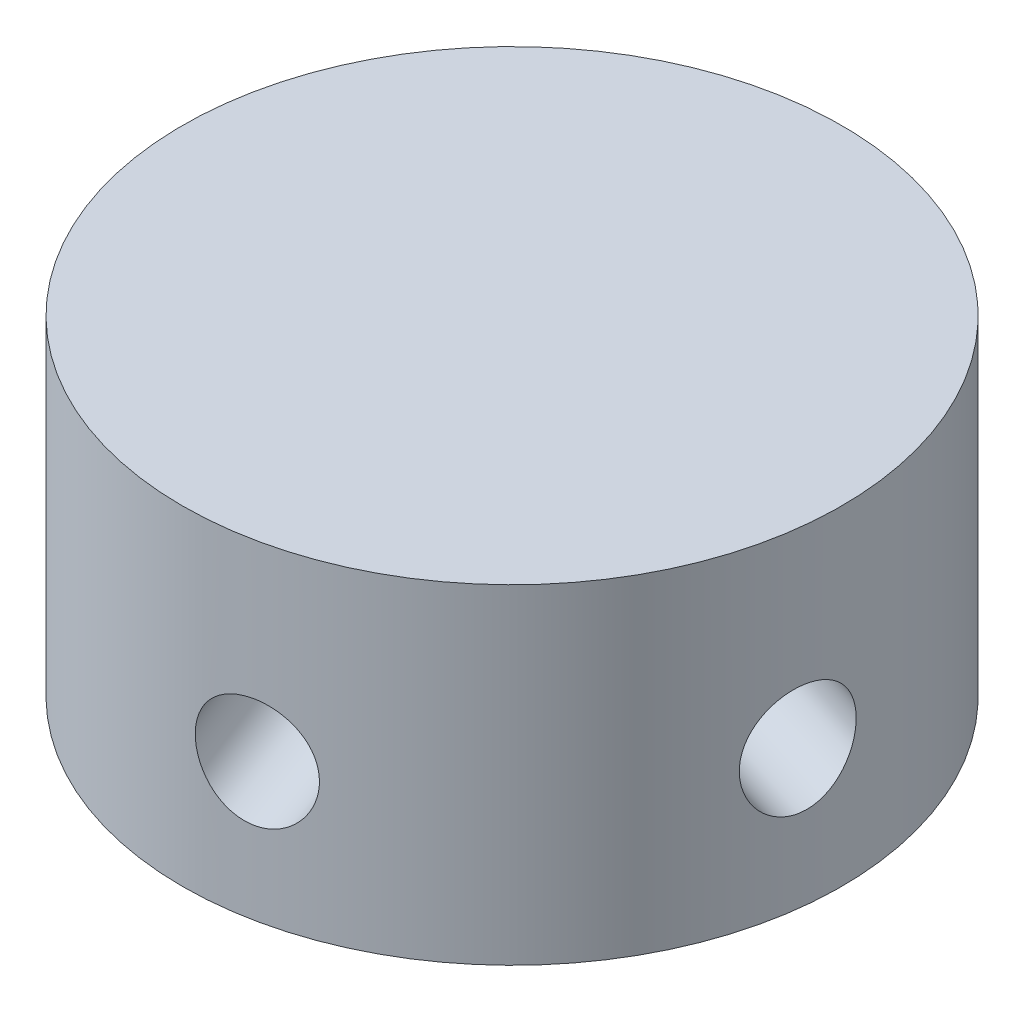
ISO-10303-21;
HEADER;
FILE_DESCRIPTION(('STEP AP214'),'2;1');
FILE_NAME('part.step','',(''),(''),'','','');
FILE_SCHEMA(('AUTOMOTIVE_DESIGN { 1 0 10303 214 1 1 1 1 }'));
ENDSEC;
DATA;
#1=APPLICATION_CONTEXT('core data for automotive mechanical design processes');
#2=APPLICATION_PROTOCOL_DEFINITION('international standard','automotive_design',2000,#1);
#3=PRODUCT_CONTEXT('',#1,'mechanical');
#4=PRODUCT('Part','Part','',(#3));
#5=PRODUCT_RELATED_PRODUCT_CATEGORY('part','',(#4));
#6=PRODUCT_DEFINITION_FORMATION('','',#4);
#7=PRODUCT_DEFINITION_CONTEXT('part definition',#1,'design');
#8=PRODUCT_DEFINITION('design','',#6,#7);
#9=PRODUCT_DEFINITION_SHAPE('','',#8);
#10=(LENGTH_UNIT() NAMED_UNIT(*) SI_UNIT(.MILLI.,.METRE.));
#11=(NAMED_UNIT(*) PLANE_ANGLE_UNIT() SI_UNIT($,.RADIAN.));
#12=(NAMED_UNIT(*) SI_UNIT($,.STERADIAN.) SOLID_ANGLE_UNIT());
#13=UNCERTAINTY_MEASURE_WITH_UNIT(LENGTH_MEASURE(1.E-05),#10,'distance_accuracy_value','');
#14=(GEOMETRIC_REPRESENTATION_CONTEXT(3) GLOBAL_UNCERTAINTY_ASSIGNED_CONTEXT((#13)) GLOBAL_UNIT_ASSIGNED_CONTEXT((#10,
#11,#12)) REPRESENTATION_CONTEXT('',''));
#15=CARTESIAN_POINT('',(0.,0.,0.));
#16=DIRECTION('',(0.,0.,1.));
#17=DIRECTION('',(1.,0.,0.));
#18=AXIS2_PLACEMENT_3D('',#15,#16,#17);
#19=CARTESIAN_POINT('',(0.,-7.,0.));
#20=DIRECTION('',(0.,1.,0.));
#21=DIRECTION('',(0.,0.,1.));
#22=AXIS2_PLACEMENT_3D('',#19,#20,#21);
#23=CYLINDRICAL_SURFACE('',#22,10.);
#24=CARTESIAN_POINT('',(-6.18040658631982,-2.80419257592395,-7.8614613417465));
#25=CARTESIAN_POINT('',(-6.18041069378116,-2.90234784309518,-7.86145985033207));
#26=CARTESIAN_POINT('',(-6.18709037837394,-3.00057569421897,-7.85622071906424));
#27=CARTESIAN_POINT('',(-6.21328313433534,-3.19429375623175,-7.83552031582612));
#28=CARTESIAN_POINT('',(-6.23281569685475,-3.28977957900091,-7.82004351843738));
#29=CARTESIAN_POINT('',(-6.28376502842835,-3.47517276967888,-7.77916181257504));
#30=CARTESIAN_POINT('',(-6.31516706385408,-3.56508689335964,-7.75376921134334));
#31=CARTESIAN_POINT('',(-6.38865971296323,-3.73693258914234,-7.69332712533847));
#32=CARTESIAN_POINT('',(-6.4307480948599,-3.81886582307326,-7.65827965680337));
#33=CARTESIAN_POINT('',(-6.5244898689366,-3.97278415857681,-7.5785772815116));
#34=CARTESIAN_POINT('',(-6.57620342226979,-4.04470142029659,-7.53386164380033));
#35=CARTESIAN_POINT('',(-6.68725447470501,-4.17534392326118,-7.43546314485651));
#36=CARTESIAN_POINT('',(-6.74659001159406,-4.23407254914793,-7.38178259049963));
#37=CARTESIAN_POINT('',(-6.86747316238743,-4.33309816932697,-7.26940523116863));
#38=CARTESIAN_POINT('',(-6.92874101682425,-4.37420107240322,-7.21111983965897));
#39=CARTESIAN_POINT('',(-7.05399457373656,-4.44028699170343,-7.08863909005609));
#40=CARTESIAN_POINT('',(-7.1179783887015,-4.46528101377072,-7.02444780130276));
#41=CARTESIAN_POINT('',(-7.2408979989159,-4.4964619358335,-6.8975752553002));
#42=CARTESIAN_POINT('',(-7.2998114016746,-4.50403920222909,-6.83521185289701));
#43=CARTESIAN_POINT('',(-7.41599656463583,-4.50415740699111,-6.70897494081218));
#44=CARTESIAN_POINT('',(-7.47326875792584,-4.49670234989006,-6.64510183778663));
#45=CARTESIAN_POINT('',(-7.58217917913624,-4.46774917979113,-6.52051620708892));
#46=CARTESIAN_POINT('',(-7.63395240425703,-4.44684381033082,-6.45978210248453));
#47=CARTESIAN_POINT('',(-7.73327325732892,-4.39246364343792,-6.34054506008151));
#48=CARTESIAN_POINT('',(-7.78082040703957,-4.35898742566933,-6.28204237522627));
#49=CARTESIAN_POINT('',(-7.87234067780815,-4.27943950635112,-6.16699590740821));
#50=CARTESIAN_POINT('',(-7.91614456968675,-4.23298937226029,-6.11058005058202));
#51=CARTESIAN_POINT('',(-7.99779809730484,-4.12962391405995,-6.00331398885442));
#52=CARTESIAN_POINT('',(-8.03564580230697,-4.0727052094075,-5.95246559029986));
#53=CARTESIAN_POINT('',(-8.10775604691805,-3.94529584290214,-5.85391396776607));
#54=CARTESIAN_POINT('',(-8.14151429694982,-3.87409566698231,-5.80675887231004));
#55=CARTESIAN_POINT('',(-8.20153607142322,-3.7234916320388,-5.72167140512811));
#56=CARTESIAN_POINT('',(-8.22779684344153,-3.64408477476704,-5.68374242118406));
#57=CARTESIAN_POINT('',(-8.27416487683236,-3.47360706993731,-5.61604816884507));
#58=CARTESIAN_POINT('',(-8.29374975039458,-3.38211206928312,-5.58698947660018));
#59=CARTESIAN_POINT('',(-8.32405447795391,-3.19457090082377,-5.54173833167563));
#60=CARTESIAN_POINT('',(-8.33477322064973,-3.09852416408824,-5.52554749189225));
#61=CARTESIAN_POINT('',(-8.34721005269621,-2.9032972349777,-5.50674303326532));
#62=CARTESIAN_POINT('',(-8.3488141503021,-2.80409289685925,-5.50430137103277));
#63=CARTESIAN_POINT('',(-8.34248086251898,-2.60668729118918,-5.51389588691072));
#64=CARTESIAN_POINT('',(-8.33454554272457,-2.50848581112889,-5.52592893077623));
#65=CARTESIAN_POINT('',(-8.30942286587974,-2.31961542955216,-5.56362998091201));
#66=CARTESIAN_POINT('',(-8.29257179549985,-2.22880300805648,-5.58880197157573));
#67=CARTESIAN_POINT('',(-8.24983112683427,-2.05390062311326,-5.65170093491985));
#68=CARTESIAN_POINT('',(-8.2239437144287,-1.96980903994349,-5.68942487119679));
#69=CARTESIAN_POINT('',(-8.16459239437144,-1.81433058777238,-5.77425211059514));
#70=CARTESIAN_POINT('',(-8.13148151790137,-1.74256485669541,-5.82090888833601));
#71=CARTESIAN_POINT('',(-8.05758249695944,-1.60987893076595,-5.92277904761302));
#72=CARTESIAN_POINT('',(-8.01679522194458,-1.54895750916636,-5.97799145998169));
#73=CARTESIAN_POINT('',(-7.9291356931972,-1.44084866104323,-6.09376440834492));
#74=CARTESIAN_POINT('',(-7.88240129647873,-1.39341115377824,-6.15419605110393));
#75=CARTESIAN_POINT('',(-7.78316118923601,-1.31197818446462,-6.27923276033471));
#76=CARTESIAN_POINT('',(-7.73065563818385,-1.27798235110665,-6.34383771146674));
#77=CARTESIAN_POINT('',(-7.62126393920933,-1.22444215000392,-6.47484261923763));
#78=CARTESIAN_POINT('',(-7.56439461267379,-1.20484509181928,-6.54123510023709));
#79=CARTESIAN_POINT('',(-7.44753128648001,-1.18040665367519,-6.67398645668238));
#80=CARTESIAN_POINT('',(-7.38753727259583,-1.17556534090098,-6.74034533197383));
#81=CARTESIAN_POINT('',(-7.26603697545491,-1.18076540289665,-6.87114840534427));
#82=CARTESIAN_POINT('',(-7.20452970867928,-1.1908167224365,-6.93559129467686));
#83=CARTESIAN_POINT('',(-7.08188582181877,-1.22556046932424,-7.06077720898353));
#84=CARTESIAN_POINT('',(-7.02074920150364,-1.25025288757539,-7.12152023625636));
#85=CARTESIAN_POINT('',(-6.90082161745449,-1.31362986693059,-7.23779262794899));
#86=CARTESIAN_POINT('',(-6.84203053304105,-1.3523137071329,-7.29332226080096));
#87=CARTESIAN_POINT('',(-6.72880950003165,-1.4426321301286,-7.39790984547475));
#88=CARTESIAN_POINT('',(-6.67437928718442,-1.49426592742231,-7.44696818954728));
#89=CARTESIAN_POINT('',(-6.57186287088399,-1.60901583583468,-7.53759282097776));
#90=CARTESIAN_POINT('',(-6.52377217819324,-1.67212374556233,-7.57916441768701));
#91=CARTESIAN_POINT('',(-6.43563400862007,-1.80807329481835,-7.65414747741365));
#92=CARTESIAN_POINT('',(-6.39558808462159,-1.88091680910276,-7.68755736524248));
#93=CARTESIAN_POINT('',(-6.32481099983414,-2.03460274266089,-7.74589484926247));
#94=CARTESIAN_POINT('',(-6.29412611305473,-2.11548235994557,-7.77078037939385));
#95=CARTESIAN_POINT('',(-6.24337632993539,-2.2825764910716,-7.81161457586409));
#96=CARTESIAN_POINT('',(-6.22330160238461,-2.36878598329015,-7.82757151610482));
#97=CARTESIAN_POINT('',(-6.19932412581324,-2.51357139572223,-7.84656075943515));
#98=CARTESIAN_POINT('',(-6.19222425836726,-2.57131759117338,-7.85215871739794));
#99=CARTESIAN_POINT('',(-6.18276429226737,-2.68743149130231,-7.85960943208847));
#100=CARTESIAN_POINT('',(-6.18040414275684,-2.74579918930467,-7.86146222900137));
#101=CARTESIAN_POINT('',(-6.18040658631982,-2.80419257592395,-7.8614613417465));
#102=B_SPLINE_CURVE_WITH_KNOTS('',3,(#24,#25,#26,#27,#28,#29,#30,#31,#32,#33,#34,#35,#36,#37,
#38,#39,#40,#41,#42,#43,#44,#45,#46,#47,#48,#49,#50,#51,#52,#53,#54,#55,#56,#57,#58,#59,#60,#61,
#62,#63,#64,#65,#66,#67,#68,#69,#70,#71,#72,#73,#74,#75,#76,#77,#78,#79,#80,#81,#82,#83,#84,#85,
#86,#87,#88,#89,#90,#91,#92,#93,#94,#95,#96,#97,#98,#99,#100,#101),.UNSPECIFIED.,.T.,.F.,(4,2,2,
2,2,2,2,2,2,2,2,2,2,2,2,2,2,2,2,2,2,2,2,2,2,2,2,2,2,2,2,2,2,2,2,2,2,2,4),(0.,0.294247369480006,
0.588941991186978,0.883272002128368,1.17754059429731,1.47371432417628,1.76981195895846,
2.05036159735739,2.33071935602934,2.58777759553048,2.84476736510533,3.091142592679,
3.33754566570429,3.59206194690359,3.84666056204865,4.12096676141902,4.39537353311392,
4.6879442991612,4.98055173114879,5.27681071896179,5.57300556860702,5.85875072810492,
6.1444268140438,6.41842323334605,6.69238863746758,6.9608803249332,7.22936459513528,
7.49686142113619,7.76435946509044,8.0320362152438,8.29971279908588,8.56737559297647,
8.83502215529133,9.10247815769814,9.36998573770895,9.63879501418435,9.90735477750061,
10.0824068686198,10.2574570814401),.UNSPECIFIED.);
#103=CARTESIAN_POINT('',(-6.18040658631982,-2.80419257592395,-7.8614613417465));
#104=VERTEX_POINT('',#103);
#105=EDGE_CURVE('E34',#104,#104,#102,.T.);
#106=ORIENTED_EDGE('',*,*,#105,.F.);
#107=EDGE_LOOP('',(#106));
#108=FACE_BOUND('',#107,.T.);
#109=CARTESIAN_POINT('',(5.56684336935079,-2.80419257592395,-8.30724111249428));
#110=CARTESIAN_POINT('',(5.56684068165602,-2.90234784309518,-8.30724455804975));
#111=CARTESIAN_POINT('',(5.5597938356678,-3.00057569421897,-8.31197833501099));
#112=CARTESIAN_POINT('',(5.53201257555666,-3.19429375623175,-8.33049234985681));
#113=CARTESIAN_POINT('',(5.51125737278652,-3.28977957900091,-8.34428632730922));
#114=CARTESIAN_POINT('',(5.4566323507206,-3.47517276967888,-8.38010887923268));
#115=CARTESIAN_POINT('',(5.42277878924899,-3.56508689335964,-8.40212724433727));
#116=CARTESIAN_POINT('',(5.34258447195922,-3.73693258914234,-8.45334527542134));
#117=CARTESIAN_POINT('',(5.29624632335746,-3.81886582307326,-8.48254344189732));
#118=CARTESIAN_POINT('',(5.19147705869945,-3.97278415857681,-8.54706777852483));
#119=CARTESIAN_POINT('',(5.13296959325439,-4.04470142029659,-8.58243239843604));
#120=CARTESIAN_POINT('',(5.0050703971945,-4.17534392326119,-8.65764141710136));
#121=CARTESIAN_POINT('',(4.93568146690598,-4.23407254914793,-8.69748466254382));
#122=CARTESIAN_POINT('',(4.79144929910144,-4.33309816932697,-8.77772485699988));
#123=CARTESIAN_POINT('',(4.7170837894715,-4.37420107240322,-8.81798287270116));
#124=CARTESIAN_POINT('',(4.56189219674915,-4.44028699170343,-8.89925745108069));
#125=CARTESIAN_POINT('',(4.48107056710181,-4.46528101377072,-8.94027347612491));
#126=CARTESIAN_POINT('',(4.32242335698893,-4.4964619358335,-9.01797119956537));
#127=CARTESIAN_POINT('',(4.24490699410614,-4.5040392022291,-9.05472982398652));
#128=CARTESIAN_POINT('',(4.08894536642164,-4.50415740699111,-9.12621912916599));
#129=CARTESIAN_POINT('',(4.01050035454146,-4.49670234989006,-9.16095034747861));
#130=CARTESIAN_POINT('',(3.85835720761111,-4.46774917979113,-9.2260312361227));
#131=CARTESIAN_POINT('',(3.78459683524983,-4.44684381033082,-9.25650262878254));
#132=CARTESIAN_POINT('',(3.64050383759365,-4.39246364343792,-9.31411610083902));
#133=CARTESIAN_POINT('',(3.57017160064663,-4.35898742566933,-9.34125780356576));
#134=CARTESIAN_POINT('',(3.43247458875423,-4.27943950635112,-9.39274743975472));
#135=CARTESIAN_POINT('',(3.36528377348706,-4.23298937226029,-9.41697395805344));
#136=CARTESIAN_POINT('',(3.23803535881906,-4.12962391405996,-9.46148404157961));
#137=CARTESIAN_POINT('',(3.17798007398682,-4.0727052094075,-9.48176632875859));
#138=CARTESIAN_POINT('',(3.06196862013124,-3.94529584290214,-9.51989312060143));
#139=CARTESIAN_POINT('',(3.00668958636109,-3.87409566698231,-9.53742739840558));
#140=CARTESIAN_POINT('',(2.90721884789784,-3.7234916320388,-9.56821802477057));
#141=CARTESIAN_POINT('',(2.86303121572234,-3.64408477476704,-9.58147280250344));
#142=CARTESIAN_POINT('',(2.78432164560611,-3.47360706993731,-9.60465274841332));
#143=CARTESIAN_POINT('',(2.75063312822817,-3.38211206928312,-9.61429944029751));
#144=CARTESIAN_POINT('',(2.69823205615212,-3.19457090082377,-9.62913757612075));
#145=CARTESIAN_POINT('',(2.67952137882051,-3.09852416408824,-9.63432846156183));
#146=CARTESIAN_POINT('',(2.65779408344942,-2.9032972349777,-9.64034569443597));
#147=CARTESIAN_POINT('',(2.6549762312517,-2.80409289685925,-9.64111676679244));
#148=CARTESIAN_POINT('',(2.66605825165338,-2.60668729118918,-9.63805832063582));
#149=CARTESIAN_POINT('',(2.67995450510481,-2.50848581112889,-9.63422979808496));
#150=CARTESIAN_POINT('',(2.72357366859686,-2.31961542955216,-9.62198697776265));
#151=CARTESIAN_POINT('',(2.7527209214665,-2.22880300805648,-9.61373923036864));
#152=CARTESIAN_POINT('',(2.82574898339175,-2.05390062311326,-9.59252728752533));
#153=CARTESIAN_POINT('',(2.86962622918195,-1.96980903994349,-9.57956423267128));
#154=CARTESIAN_POINT('',(2.96864229450736,-1.81433058777238,-9.54933083154011));
#155=CARTESIAN_POINT('',(3.02324735053505,-1.74256485669541,-9.5322582539377));
#156=CARTESIAN_POINT('',(3.1429676826702,-1.60987893076595,-9.49345571895933));
#157=CARTESIAN_POINT('',(3.20808176836764,-1.54895750916636,-9.47172628899688));
#158=CARTESIAN_POINT('',(3.34527666942103,-1.44084866104323,-9.42413293149946));
#159=CARTESIAN_POINT('',(3.41719229986527,-1.39341115377824,-9.39836028357576));
#160=CARTESIAN_POINT('',(3.56677615661691,-1.31197818446462,-9.34261580097778));
#161=CARTESIAN_POINT('',(3.64444422395009,-1.27798235110665,-9.31264408232851));
#162=CARTESIAN_POINT('',(3.80284118917892,-1.22444215000392,-9.24908913703792));
#163=CARTESIAN_POINT('',(3.88355777922459,-1.20484509181928,-9.21551959838653));
#164=CARTESIAN_POINT('',(4.04592457563197,-1.18040665367519,-9.14539839566193));
#165=CARTESIAN_POINT('',(4.12757478624289,-1.17556534090098,-9.10884671801134));
#166=CARTESIAN_POINT('',(4.28952155816143,-1.18076540289665,-9.03371344127161));
#167=CARTESIAN_POINT('',(4.36981717870131,-1.1908167224365,-8.99513050237554));
#168=CARTESIAN_POINT('',(4.52677510354712,-1.22556046932424,-8.91717380957021));
#169=CARTESIAN_POINT('',(4.60343741011047,-1.25025288757539,-8.87780005615232));
#170=CARTESIAN_POINT('',(4.75107868746049,-1.31362986693059,-8.79967229086849));
#171=CARTESIAN_POINT('',(4.82205795083332,-1.3523137071329,-8.76091824717969));
#172=CARTESIAN_POINT('',(4.95651387808148,-1.4426321301286,-8.68555798701927));
#173=CARTESIAN_POINT('',(5.01999099666755,-1.49426592742231,-8.64895164044187));
#174=CARTESIAN_POINT('',(5.1378594577656,-1.60901583583468,-8.57945728591311));
#175=CARTESIAN_POINT('',(5.19225723702143,-1.67212374556233,-8.54656664912289));
#176=CARTESIAN_POINT('',(5.29080655683742,-1.80807329481835,-8.48591330836175));
#177=CARTESIAN_POINT('',(5.3349561194367,-1.88091680910276,-8.45815159451121));
#178=CARTESIAN_POINT('',(5.41230968576981,-2.03460274266089,-8.40886586079098));
#179=CARTESIAN_POINT('',(5.44545938284803,-2.11548235994557,-8.38737285099227));
#180=CARTESIAN_POINT('',(5.49997755693345,-2.2825764910716,-8.35172539971701));
#181=CARTESIAN_POINT('',(5.52135694090016,-2.36878598329015,-8.3375641649796));
#182=CARTESIAN_POINT('',(5.54682623225177,-2.51357139572223,-8.32062822854148));
#183=CARTESIAN_POINT('',(5.55434418634884,-2.57131759117338,-8.31560571748645));
#184=CARTESIAN_POINT('',(5.5643535273974,-2.68743149130231,-8.30891115254283));
#185=CARTESIAN_POINT('',(5.56684496828281,-2.74579918930467,-8.30723906270461));
#186=CARTESIAN_POINT('',(5.56684336935079,-2.80419257592395,-8.30724111249428));
#187=B_SPLINE_CURVE_WITH_KNOTS('',3,(#109,#110,#111,#112,#113,#114,#115,#116,#117,#118,#119,
#120,#121,#122,#123,#124,#125,#126,#127,#128,#129,#130,#131,#132,#133,#134,#135,#136,#137,#138,
#139,#140,#141,#142,#143,#144,#145,#146,#147,#148,#149,#150,#151,#152,#153,#154,#155,#156,#157,
#158,#159,#160,#161,#162,#163,#164,#165,#166,#167,#168,#169,#170,#171,#172,#173,#174,#175,#176,
#177,#178,#179,#180,#181,#182,#183,#184,#185,#186),.UNSPECIFIED.,.T.,.F.,(4,2,2,2,2,2,2,2,2,2,2,
2,2,2,2,2,2,2,2,2,2,2,2,2,2,2,2,2,2,2,2,2,2,2,2,2,2,2,4),(0.,0.294247369480007,
0.588941991186979,0.88327200212837,1.17754059429731,1.47371432417628,1.76981195895846,
2.05036159735739,2.33071935602934,2.58777759553048,2.84476736510533,3.091142592679,
3.33754566570429,3.59206194690359,3.84666056204865,4.12096676141902,4.39537353311392,
4.6879442991612,4.98055173114879,5.27681071896179,5.57300556860702,5.85875072810493,
6.1444268140438,6.41842323334606,6.69238863746758,6.9608803249332,7.22936459513529,
7.49686142113619,7.76435946509044,8.0320362152438,8.29971279908588,8.56737559297647,
8.83502215529133,9.10247815769814,9.36998573770896,9.63879501418435,9.90735477750061,
10.0824068686198,10.2574570814401),.UNSPECIFIED.);
#188=CARTESIAN_POINT('',(5.56684336935079,-2.80419257592395,-8.30724111249428));
#189=VERTEX_POINT('',#188);
#190=EDGE_CURVE('E89',#189,#189,#187,.T.);
#191=ORIENTED_EDGE('',*,*,#190,.F.);
#192=EDGE_LOOP('',(#191));
#193=FACE_BOUND('',#192,.T.);
#194=CARTESIAN_POINT('',(9.92735308998561,-4.50322630338943,1.20318769390029));
#195=CARTESIAN_POINT('',(9.93747158086751,-4.50611583843854,1.11968976236709));
#196=CARTESIAN_POINT('',(9.94656365977674,-4.50178304837939,1.03576684298313));
#197=CARTESIAN_POINT('',(9.9624661113616,-4.47884815399744,0.869629076678414));
#198=CARTESIAN_POINT('',(9.96927428677865,-4.46023236479396,0.787415945583453));
#199=CARTESIAN_POINT('',(9.98062867071901,-4.40963627823444,0.627282609305298));
#200=CARTESIAN_POINT('',(9.98518021682377,-4.37768784959331,0.549352665483974));
#201=CARTESIAN_POINT('',(9.99229678886943,-4.30173146568903,0.399548007862777));
#202=CARTESIAN_POINT('',(9.99486174569541,-4.25772309092354,0.327673504813696));
#203=CARTESIAN_POINT('',(9.99846782325065,-4.15722061048359,0.188834448148185));
#204=CARTESIAN_POINT('',(9.99944461795647,-4.10030129130652,0.122176792796473));
#205=CARTESIAN_POINT('',(10.000191736081,-3.97687044676209,-0.00157118390889381));
#206=CARTESIAN_POINT('',(9.99996165377224,-3.91035570291724,-0.0586582811790624));
#207=CARTESIAN_POINT('',(9.99877298805763,-3.76384268192975,-0.166355199607757));
#208=CARTESIAN_POINT('',(9.99775735406143,-3.68319042631406,-0.21607598845621));
#209=CARTESIAN_POINT('',(9.99553162089881,-3.51496774271233,-0.301993473386274));
#210=CARTESIAN_POINT('',(9.994321459765,-3.42739511474905,-0.338185847680939));
#211=CARTESIAN_POINT('',(9.99214475836298,-3.24336619318965,-0.397457240081453));
#212=CARTESIAN_POINT('',(9.99119221933799,-3.1466860486199,-0.419845630271942));
#213=CARTESIAN_POINT('',(9.98997443116463,-2.95091352349594,-0.447898162480003));
#214=CARTESIAN_POINT('',(9.98970915334956,-2.85182124372955,-0.453563002063254));
#215=CARTESIAN_POINT('',(9.98997568776477,-2.65525702638746,-0.447654862845942));
#216=CARTESIAN_POINT('',(9.99049850373749,-2.55777945013345,-0.436276445782735));
#217=CARTESIAN_POINT('',(9.99215335482241,-2.36634287483814,-0.396564915311679));
#218=CARTESIAN_POINT('',(9.99328522731719,-2.27238294374863,-0.368236327354412));
#219=CARTESIAN_POINT('',(9.99565636177197,-2.09496299673918,-0.296758152954159));
#220=CARTESIAN_POINT('',(9.99688892730428,-2.01122538412609,-0.254297055812373));
#221=CARTESIAN_POINT('',(9.99891334558655,-1.85241205398823,-0.15544858565793));
#222=CARTESIAN_POINT('',(9.99970528156228,-1.77733470284466,-0.0990638454394954));
#223=CARTESIAN_POINT('',(10.0001535387467,-1.64051789357053,0.0238823714026653));
#224=CARTESIAN_POINT('',(9.99984675535424,-1.57841786272031,0.0900429836730084));
#225=CARTESIAN_POINT('',(9.99756202838942,-1.46630729881968,0.23189170496111));
#226=CARTESIAN_POINT('',(9.99558420163241,-1.4162959210183,0.307579147684775));
#227=CARTESIAN_POINT('',(9.9894764346614,-1.33027339058666,0.465306593080012));
#228=CARTESIAN_POINT('',(9.98537168516191,-1.29410679819969,0.547262868864093));
#229=CARTESIAN_POINT('',(9.97469882670128,-1.23592461440921,0.715901872032834));
#230=CARTESIAN_POINT('',(9.96813073798167,-1.21390890673034,0.802584560575034));
#231=CARTESIAN_POINT('',(9.95243946460123,-1.18461552438532,0.978112721952867));
#232=CARTESIAN_POINT('',(9.94331817823612,-1.17732693310918,1.0669565433517));
#233=CARTESIAN_POINT('',(9.92268067853598,-1.17764248148586,1.24433950491424));
#234=CARTESIAN_POINT('',(9.9111644558854,-1.18524667906793,1.33287864389147));
#235=CARTESIAN_POINT('',(9.88615666531998,-1.21516102778183,1.50720523339001));
#236=CARTESIAN_POINT('',(9.87266392129036,-1.23747996268658,1.59299100823057));
#237=CARTESIAN_POINT('',(9.8443798474004,-1.29624869601392,1.75934922279337));
#238=CARTESIAN_POINT('',(9.82958853329444,-1.33269832301985,1.83992172574296));
#239=CARTESIAN_POINT('',(9.79958146819504,-1.41872943258444,1.99357342171471));
#240=CARTESIAN_POINT('',(9.78436595790433,-1.46830359828222,2.06665675851568));
#241=CARTESIAN_POINT('',(9.75448615573963,-1.57922779388592,2.20338517182545));
#242=CARTESIAN_POINT('',(9.73982184666738,-1.64057745601468,2.26703054299466));
#243=CARTESIAN_POINT('',(9.71204281917471,-1.77334593453038,2.3832340763728));
#244=CARTESIAN_POINT('',(9.69892869479173,-1.84476858808605,2.43578799430921));
#245=CARTESIAN_POINT('',(9.67517431857508,-1.99561388433194,2.52849769883648));
#246=CARTESIAN_POINT('',(9.66453409775658,-2.07503662730087,2.5686533299929));
#247=CARTESIAN_POINT('',(9.64636774595636,-2.24043354768507,2.63606282413499));
#248=CARTESIAN_POINT('',(9.63887350834762,-2.32646483157541,2.66318493730356));
#249=CARTESIAN_POINT('',(9.62763461524281,-2.50195468590873,2.7035333093719));
#250=CARTESIAN_POINT('',(9.62389048520026,-2.59141373481684,2.71675762096731));
#251=CARTESIAN_POINT('',(9.62028554157676,-2.77404457649806,2.72949698535217));
#252=CARTESIAN_POINT('',(9.62054338150975,-2.86724772045195,2.72859315038128));
#253=CARTESIAN_POINT('',(9.62512160451679,-3.05229313121454,2.71239749907065));
#254=CARTESIAN_POINT('',(9.62944296169443,-3.14413506635284,2.69710223282622));
#255=CARTESIAN_POINT('',(9.64203841119566,-3.32803733023408,2.65173003156966));
#256=CARTESIAN_POINT('',(9.65047469065912,-3.41993678405649,2.62104497712594));
#257=CARTESIAN_POINT('',(9.67069145979926,-3.59730393228497,2.54543724825957));
#258=CARTESIAN_POINT('',(9.68247270396796,-3.68277017010274,2.50051136140061));
#259=CARTESIAN_POINT('',(9.70881886923832,-3.84670132949995,2.39620308017121));
#260=CARTESIAN_POINT('',(9.72344054533483,-3.92496503751464,2.33651768067541));
#261=CARTESIAN_POINT('',(9.75422250490331,-4.06967581198045,2.20447803636209));
#262=CARTESIAN_POINT('',(9.77038291520708,-4.13612190305521,2.13212274680237));
#263=CARTESIAN_POINT('',(9.80248646043133,-4.25247409998337,1.97917783489853));
#264=CARTESIAN_POINT('',(9.81841739257082,-4.3028778508246,1.8989652082616));
#265=CARTESIAN_POINT('',(9.84949876089979,-4.38788221630196,1.73050781058989));
#266=CARTESIAN_POINT('',(9.8646505948503,-4.42251207536418,1.64227827016818));
#267=CARTESIAN_POINT('',(9.88779604627379,-4.46447792520214,1.49492175671137));
#268=CARTESIAN_POINT('',(9.89633516158306,-4.47718169552662,1.43735988808217));
#269=CARTESIAN_POINT('',(9.91253806276659,-4.49553453526019,1.32099860608937));
#270=CARTESIAN_POINT('',(9.92020191554303,-4.50118414419441,1.26219928771976));
#271=CARTESIAN_POINT('',(9.92735308998561,-4.50322630338943,1.20318769390029));
#272=B_SPLINE_CURVE_WITH_KNOTS('',3,(#194,#195,#196,#197,#198,#199,#200,#201,#202,#203,#204,
#205,#206,#207,#208,#209,#210,#211,#212,#213,#214,#215,#216,#217,#218,#219,#220,#221,#222,#223,
#224,#225,#226,#227,#228,#229,#230,#231,#232,#233,#234,#235,#236,#237,#238,#239,#240,#241,#242,
#243,#244,#245,#246,#247,#248,#249,#250,#251,#252,#253,#254,#255,#256,#257,#258,#259,#260,#261,
#262,#263,#264,#265,#266,#267,#268,#269,#270,#271),.UNSPECIFIED.,.T.,.F.,(4,2,2,2,2,2,2,2,2,2,2,
2,2,2,2,2,2,2,2,2,2,2,2,2,2,2,2,2,2,2,2,2,2,2,2,2,2,2,4),(0.,0.252248403203044,0.50473879386721,
0.756629088117828,1.00852814542465,1.27039654907248,1.53235299318959,1.81535800382181,
2.09845334611585,2.39475726963461,2.69104883367463,2.98398368367868,3.27684035918863,
3.55712444850328,3.83735557997979,4.10826598771179,4.37915745884014,4.64691151112121,
4.9146633632858,5.18221666901757,5.44977101546732,5.71748521982135,5.98519617668867,
6.25275819925242,6.5203118665682,6.78796773148794,7.05562695181105,7.325937691841,
7.59628630168278,7.87466534218203,8.15311113253284,8.44354639949903,8.73404722931548,
9.03109548314861,9.32816824272805,9.6148399080652,9.9009779057113,10.0792663817537,
10.2575412208797),.UNSPECIFIED.);
#273=CARTESIAN_POINT('',(9.92735308998561,-4.50322630338943,1.20318769390029));
#274=VERTEX_POINT('',#273);
#275=EDGE_CURVE('E93',#274,#274,#272,.T.);
#276=ORIENTED_EDGE('',*,*,#275,.F.);
#277=EDGE_LOOP('',(#276));
#278=FACE_BOUND('',#277,.T.);
#279=CARTESIAN_POINT('',(1.8869488312424,-1.17988271041713,9.820357636475));
#280=CARTESIAN_POINT('',(1.79945112973037,-1.18475788519567,9.83716851436081));
#281=CARTESIAN_POINT('',(1.71207388780583,-1.1970615964251,9.85273427537302));
#282=CARTESIAN_POINT('',(1.54011446951967,-1.23623501154644,9.88107607464319));
#283=CARTESIAN_POINT('',(1.45553513038818,-1.26311904764654,9.8938493505731));
#284=CARTESIAN_POINT('',(1.29172968985668,-1.33074121411888,9.91656548624668));
#285=CARTESIAN_POINT('',(1.21250170286714,-1.37147443377837,9.92650934696596));
#286=CARTESIAN_POINT('',(1.06173684355278,-1.46568816415509,9.94376591611577));
#287=CARTESIAN_POINT('',(0.990198215564105,-1.51916575601907,9.95107922606232));
#288=CARTESIAN_POINT('',(0.856928562793337,-1.63736917986167,9.96344117134831));
#289=CARTESIAN_POINT('',(0.795194342733253,-1.70209133275477,9.96849054549149));
#290=CARTESIAN_POINT('',(0.68328916963773,-1.84095631188058,9.97678675316516));
#291=CARTESIAN_POINT('',(0.633118430497757,-1.91509931233605,9.98003355335411));
#292=CARTESIAN_POINT('',(0.54546333421314,-2.07109010181131,9.98520987540477));
#293=CARTESIAN_POINT('',(0.508047312370338,-2.15297648026065,9.98713235637642));
#294=CARTESIAN_POINT('',(0.44713872562204,-2.32178014588872,9.99004511315271));
#295=CARTESIAN_POINT('',(0.423647416805991,-2.40869788614929,9.99103530486424));
#296=CARTESIAN_POINT('',(0.390591417550573,-2.58715311039519,9.99238320734883));
#297=CARTESIAN_POINT('',(0.381350410993513,-2.67875046191643,9.9927262563929));
#298=CARTESIAN_POINT('',(0.377720989293566,-2.86223482854569,9.99286381786895));
#299=CARTESIAN_POINT('',(0.383335721731672,-2.95412190091889,9.99265821405422));
#300=CARTESIAN_POINT('',(0.409498262249908,-3.13958461146535,9.99162097134035));
#301=CARTESIAN_POINT('',(0.430648645751802,-3.23307511652322,9.9907640208221));
#302=CARTESIAN_POINT('',(0.487770991347369,-3.41541140782257,9.98813748471376));
#303=CARTESIAN_POINT('',(0.523746946708113,-3.50425593539916,9.98636765320688));
#304=CARTESIAN_POINT('',(0.61102164830908,-3.67793018914257,9.98141395066469));
#305=CARTESIAN_POINT('',(0.66280775309257,-3.76251443694909,9.97818324657079));
#306=CARTESIAN_POINT('',(0.779887302249498,-3.92167683340661,9.96971466213185));
#307=CARTESIAN_POINT('',(0.845181587810697,-3.99625435843725,9.96447665676988));
#308=CARTESIAN_POINT('',(0.986696434114059,-4.13189888314325,9.95145224670999));
#309=CARTESIAN_POINT('',(1.06275908429531,-4.19313332764407,9.94370088320829));
#310=CARTESIAN_POINT('',(1.22439088781583,-4.30081455654523,9.92509236242018));
#311=CARTESIAN_POINT('',(1.30995475224262,-4.34726951292676,9.91423692778642));
#312=CARTESIAN_POINT('',(1.48149520274686,-4.42039515155083,9.89000123370738));
#313=CARTESIAN_POINT('',(1.56700117290235,-4.44824673456581,9.87685818054688));
#314=CARTESIAN_POINT('',(1.7411721211486,-4.48785940730089,9.8476440814622));
#315=CARTESIAN_POINT('',(1.82983527128239,-4.49962965729237,9.83157470834974));
#316=CARTESIAN_POINT('',(2.00061640842381,-4.50620850746607,9.79819054534492));
#317=CARTESIAN_POINT('',(2.08272613451838,-4.50222396319129,9.78105977801961));
#318=CARTESIAN_POINT('',(2.24465436031334,-4.48016765933825,9.7451732958157));
#319=CARTESIAN_POINT('',(2.3244730679195,-4.46209718225012,9.72641772900934));
#320=CARTESIAN_POINT('',(2.4786521356151,-4.41300188845494,9.68826715227286));
#321=CARTESIAN_POINT('',(2.55306887208699,-4.38214423029697,9.66888326539049));
#322=CARTESIAN_POINT('',(2.69584433373164,-4.30871265039763,9.63005220169523));
#323=CARTESIAN_POINT('',(2.7642017989999,-4.26613629950782,9.61060501258733));
#324=CARTESIAN_POINT('',(2.89714975163433,-4.16803837314638,9.57139471127444));
#325=CARTESIAN_POINT('',(2.96131666972515,-4.11192663970629,9.55167460859289));
#326=CARTESIAN_POINT('',(3.08028130015328,-3.99002612270598,9.51397759575605));
#327=CARTESIAN_POINT('',(3.13507556550246,-3.92423379538252,9.49600132797994));
#328=CARTESIAN_POINT('',(3.23839582013824,-3.77916184450483,9.46128964444992));
#329=CARTESIAN_POINT('',(3.28607166204278,-3.69922470291531,9.4447679979217));
#330=CARTESIAN_POINT('',(3.36861333681781,-3.53231996698333,9.41564471149395));
#331=CARTESIAN_POINT('',(3.40347519681208,-3.44535020240932,9.40304428752458));
#332=CARTESIAN_POINT('',(3.46100545316147,-3.26225642729358,9.38202713505442));
#333=CARTESIAN_POINT('',(3.48300099583674,-3.16589303513736,9.37384277009261));
#334=CARTESIAN_POINT('',(3.51136017725102,-2.97057074708831,9.36325710649528));
#335=CARTESIAN_POINT('',(3.51772416167656,-2.87161190864178,9.36085567997208));
#336=CARTESIAN_POINT('',(3.51433178540988,-2.6749381347884,9.36212990295936));
#337=CARTESIAN_POINT('',(3.50472924620439,-2.57722036376153,9.36574756478833));
#338=CARTESIAN_POINT('',(3.46954388654891,-2.38510669647371,9.37883870164833));
#339=CARTESIAN_POINT('',(3.44396531298001,-2.29070992443957,9.38831062044557));
#340=CARTESIAN_POINT('',(3.37861378028614,-2.1122239181654,9.41201963799943));
#341=CARTESIAN_POINT('',(3.33949209244676,-2.02786686659047,9.42603649247039));
#342=CARTESIAN_POINT('',(3.24775543901785,-1.86767474776899,9.45803536700821));
#343=CARTESIAN_POINT('',(3.19514350676156,-1.79183777025694,9.47601649556559));
#344=CARTESIAN_POINT('',(3.07977465382465,-1.65347380868961,9.51412324241499));
#345=CARTESIAN_POINT('',(3.01742430032603,-1.59058146667273,9.53415496109061));
#346=CARTESIAN_POINT('',(2.88299644381022,-1.47678152203921,9.57566018822197));
#347=CARTESIAN_POINT('',(2.81091766961876,-1.42587548801578,9.5971338849107));
#348=CARTESIAN_POINT('',(2.65991876126379,-1.33802625594269,9.64006834607164));
#349=CARTESIAN_POINT('',(2.58108928316139,-1.30092554630175,9.66152627940089));
#350=CARTESIAN_POINT('',(2.41807071745498,-1.24086915211944,9.70360732041632));
#351=CARTESIAN_POINT('',(2.33388706771279,-1.21789936112565,9.72423124138736));
#352=CARTESIAN_POINT('',(2.18892071746701,-1.19146477335558,9.75768152617976));
#353=CARTESIAN_POINT('',(2.12890975904827,-1.18417271969729,9.77095423583315));
#354=CARTESIAN_POINT('',(2.00822954382959,-1.17669311347784,9.79646967199437));
#355=CARTESIAN_POINT('',(1.94756028556266,-1.17650557675206,9.80871239620639));
#356=CARTESIAN_POINT('',(1.8869488312424,-1.17988271041713,9.820357636475));
#357=B_SPLINE_CURVE_WITH_KNOTS('',3,(#279,#280,#281,#282,#283,#284,#285,#286,#287,#288,#289,
#290,#291,#292,#293,#294,#295,#296,#297,#298,#299,#300,#301,#302,#303,#304,#305,#306,#307,#308,
#309,#310,#311,#312,#313,#314,#315,#316,#317,#318,#319,#320,#321,#322,#323,#324,#325,#326,#327,
#328,#329,#330,#331,#332,#333,#334,#335,#336,#337,#338,#339,#340,#341,#342,#343,#344,#345,#346,
#347,#348,#349,#350,#351,#352,#353,#354,#355,#356),.UNSPECIFIED.,.T.,.F.,(4,2,2,2,2,2,2,2,2,2,2,
2,2,2,2,2,2,2,2,2,2,2,2,2,2,2,2,2,2,2,2,2,2,2,2,2,2,2,4),(0.,0.267469811619867,
0.535203019253906,0.802841391544759,1.07041852522662,1.33790827518966,1.60540297264682,
1.87430908120209,2.14323944294974,2.41819277890536,2.69320437565799,2.97948684341757,
3.26584647179837,3.56211992190501,3.85841182724718,4.15073869864069,4.4429036524975,
4.71409391774852,4.98512964272775,5.23582093139192,5.48648939788597,5.73397953571808,
5.98152101405834,6.24288684630809,6.50434859557287,6.78669252311201,7.06912391551495,
7.36524356240143,7.6613566606451,7.95463350173545,8.24783241472102,8.52853798326313,
8.80918048934631,9.08026442131184,9.35138380909724,9.61930742364079,9.88696314259754,
10.0722445597595,10.2575263898977),.UNSPECIFIED.);
#358=CARTESIAN_POINT('',(1.8869488312424,-1.17988271041713,9.820357636475));
#359=VERTEX_POINT('',#358);
#360=EDGE_CURVE('E58',#359,#359,#357,.T.);
#361=ORIENTED_EDGE('',*,*,#360,.F.);
#362=EDGE_LOOP('',(#361));
#363=FACE_BOUND('',#362,.T.);
#364=CARTESIAN_POINT('',(-9.38654470399011,-2.80419257592395,3.44859080205164));
#365=CARTESIAN_POINT('',(-9.38654455484606,-2.90234784309518,3.44859516935191));
#366=CARTESIAN_POINT('',(-9.38362598097031,-3.00057569421897,3.45656690750819));
#367=CARTESIAN_POINT('',(-9.37203273430235,-3.19429375623175,3.487874475136));
#368=CARTESIAN_POINT('',(-9.36334931905659,-3.28977957900091,3.51123363941165));
#369=CARTESIAN_POINT('',(-9.34021271560724,-3.47517276967888,3.5723224750761));
#370=CARTESIAN_POINT('',(-9.32576667934466,-3.56508689335964,3.61003433080466));
#371=CARTESIAN_POINT('',(-9.29099331712761,-3.73693258914234,3.69860762539069));
#372=CARTESIAN_POINT('',(-9.27066721906948,-3.81886582307326,3.74946631864099));
#373=CARTESIAN_POINT('',(-9.22383355695659,-3.97278415857681,3.86324943218292));
#374=CARTESIAN_POINT('',(-9.19728682515046,-4.04470142029659,3.92624983602832));
#375=CARTESIAN_POINT('',(-9.13802095398199,-4.17534392326118,4.0622724714829));
#376=CARTESIAN_POINT('',(-9.10530340223162,-4.23407254914793,4.13529212405284));
#377=CARTESIAN_POINT('',(-9.03578113028456,-4.33309816932697,4.28498534614142));
#378=CARTESIAN_POINT('',(-8.99928123711436,-4.37420107240322,4.36126571484327));
#379=CARTESIAN_POINT('',(-8.92150059977564,-4.44028699170343,4.51823755944494));
#380=CARTESIAN_POINT('',(-8.88022314250651,-4.46528101377072,4.59892598272037));
#381=CARTESIAN_POINT('',(-8.79754442939001,-4.4964619358335,4.75503525182965));
#382=CARTESIAN_POINT('',(-8.75643855180501,-4.5040392022291,4.83033657859006));
#383=CARTESIAN_POINT('',(-8.67228330381901,-4.50415740699111,4.97984458607278));
#384=CARTESIAN_POINT('',(-8.6292344540023,-4.49670234989006,5.05405155302212));
#385=CARTESIAN_POINT('',(-8.54440164910905,-4.46774917979113,5.19613059594723));
#386=CARTESIAN_POINT('',(-8.50263888957962,-4.44684381033082,5.26413772952888));
#387=CARTESIAN_POINT('',(-8.4199295549135,-4.39246364343792,5.39544374650843));
#388=CARTESIAN_POINT('',(-8.37898307255584,-4.35898742566933,5.45874209690884));
#389=CARTESIAN_POINT('',(-8.29784869865801,-4.27943950635112,5.58133436049498));
#390=CARTESIAN_POINT('',(-8.25773017741134,-4.23298937226029,5.64042779581673));
#391=CARTESIAN_POINT('',(-8.18094641811264,-4.12962391405996,5.7512319513299));
#392=CARTESIAN_POINT('',(-8.1442823013679,-4.0727052094075,5.8029402770891));
#393=CARTESIAN_POINT('',(-8.07283742961904,-3.94529584290214,5.90197532130427));
#394=CARTESIAN_POINT('',(-8.03842214176924,-3.87409566698231,5.94865305084299));
#395=CARTESIAN_POINT('',(-7.97604689999563,-3.72349163203881,6.03203062394306));
#396=CARTESIAN_POINT('',(-7.94808931749826,-3.64408477476704,6.0687268029121));
#397=CARTESIAN_POINT('',(-7.89803676800905,-3.47360706993731,6.13374409761049));
#398=CARTESIAN_POINT('',(-7.87645236815793,-3.38211206928312,6.16135004897064));
#399=CARTESIAN_POINT('',(-7.84278064773336,-3.19457090082377,6.20415493038711));
#400=CARTESIAN_POINT('',(-7.83069451770443,-3.09852416408824,6.21935230512072));
#401=CARTESIAN_POINT('',(-7.81665360725043,-2.90329723497771,6.23699133256634));
#402=CARTESIAN_POINT('',(-7.81482714189443,-2.80409289685925,6.23927143517157));
#403=CARTESIAN_POINT('',(-7.8219949751856,-2.60668729118918,6.23028325209678));
#404=CARTESIAN_POINT('',(-7.83098693129249,-2.50848581112889,6.21901789944892));
#405=CARTESIAN_POINT('',(-7.85907942660605,-2.31961542955216,6.18347454873112));
#406=CARTESIAN_POINT('',(-7.8778121452341,-2.22880300805648,6.15966965554244));
#407=CARTESIAN_POINT('',(-7.92442502122213,-2.05390062311326,6.09958401549534));
#408=CARTESIAN_POINT('',(-7.9523029662649,-1.96980903994349,6.0633062858327));
#409=CARTESIAN_POINT('',(-8.01463789851775,-1.81433058777238,5.98064676758153));
#410=CARTESIAN_POINT('',(-8.04877930748964,-1.74256485669541,5.93473871552971));
#411=CARTESIAN_POINT('',(-8.12282753294734,-1.60987893076595,5.83297695967879));
#412=CARTESIAN_POINT('',(-8.1627336963771,-1.54895750916636,5.77712438227162));
#413=CARTESIAN_POINT('',(-8.24575202922682,-1.44084866104323,5.65797940770794));
#414=CARTESIAN_POINT('',(-8.28878421405532,-1.39341115377824,5.59485795056319));
#415=CARTESIAN_POINT('',(-8.37703431148377,-1.31197818446462,5.46183653181914));
#416=CARTESIAN_POINT('',(-8.42225216366868,-1.27798235110665,5.39193675752875));
#417=CARTESIAN_POINT('',(-8.51304134084415,-1.22444215000392,5.2474163265427));
#418=CARTESIAN_POINT('',(-8.55861075417355,-1.20484509181928,5.17281397803622));
#419=CARTESIAN_POINT('',(-8.6487520429548,-1.18040665367519,5.02064792497577));
#420=CARTESIAN_POINT('',(-8.69332391386377,-1.17556534090098,4.94308420693986));
#421=CARTESIAN_POINT('',(-8.78017937250602,-1.18076540289665,4.78711018502425));
#422=CARTESIAN_POINT('',(-8.82246141162344,-1.1908167224365,4.70869935018739));
#423=CARTESIAN_POINT('',(-8.90362124587707,-1.22556046932424,4.55337350742781));
#424=CARTESIAN_POINT('',(-8.94249904312836,-1.25025288757539,4.47645849857575));
#425=CARTESIAN_POINT('',(-9.01602099734735,-1.31362986693059,4.32647044327263));
#426=CARTESIAN_POINT('',(-9.05066537231721,-1.3523137071329,4.25339719909851));
#427=CARTESIAN_POINT('',(-9.11514685292419,-1.4426321301286,4.11339825680843));
#428=CARTESIAN_POINT('',(-9.14498424995578,-1.49426592742231,4.04647218616243));
#429=CARTESIAN_POINT('',(-9.19949408137533,-1.60901583583468,3.9209687291917));
#430=CARTESIAN_POINT('',(-9.22417017800576,-1.67212374556233,3.86238543266855));
#431=CARTESIAN_POINT('',(-9.26824711331932,-1.80807329481835,3.75539001241589));
#432=CARTESIAN_POINT('',(-9.28764693377664,-1.88091680910276,3.70697985232681));
#433=CARTESIAN_POINT('',(-9.32125785608648,-2.03460274266089,3.62163957066408));
#434=CARTESIAN_POINT('',(-9.33544325019408,-2.11548235994557,3.58476645741611));
#435=CARTESIAN_POINT('',(-9.35859633339007,-2.2825764910716,3.52388208481895));
#436=CARTESIAN_POINT('',(-9.3675688534155,-2.36878598329015,3.49985891865632));
#437=CARTESIAN_POINT('',(-9.37821924928155,-2.51357139572223,3.47118698441941));
#438=CARTESIAN_POINT('',(-9.38134924398139,-2.57131759117338,3.46270474507578));
#439=CARTESIAN_POINT('',(-9.3855120044478,-2.68743149130231,3.45140538521294));
#440=CARTESIAN_POINT('',(-9.38654479271715,-2.74579918930467,3.4485882039083));
#441=CARTESIAN_POINT('',(-9.38654470399011,-2.80419257592395,3.44859080205164));
#442=B_SPLINE_CURVE_WITH_KNOTS('',3,(#364,#365,#366,#367,#368,#369,#370,#371,#372,#373,#374,
#375,#376,#377,#378,#379,#380,#381,#382,#383,#384,#385,#386,#387,#388,#389,#390,#391,#392,#393,
#394,#395,#396,#397,#398,#399,#400,#401,#402,#403,#404,#405,#406,#407,#408,#409,#410,#411,#412,
#413,#414,#415,#416,#417,#418,#419,#420,#421,#422,#423,#424,#425,#426,#427,#428,#429,#430,#431,
#432,#433,#434,#435,#436,#437,#438,#439,#440,#441),.UNSPECIFIED.,.T.,.F.,(4,2,2,2,2,2,2,2,2,2,2,
2,2,2,2,2,2,2,2,2,2,2,2,2,2,2,2,2,2,2,2,2,2,2,2,2,2,2,4),(0.,0.294247369480007,
0.588941991186979,0.883272002128369,1.17754059429731,1.47371432417628,1.76981195895846,
2.05036159735739,2.33071935602934,2.58777759553048,2.84476736510533,3.091142592679,
3.33754566570429,3.59206194690359,3.84666056204865,4.12096676141902,4.39537353311392,
4.6879442991612,4.98055173114879,5.27681071896179,5.57300556860702,5.85875072810492,
6.1444268140438,6.41842323334606,6.69238863746758,6.9608803249332,7.22936459513529,
7.49686142113619,7.76435946509044,8.0320362152438,8.29971279908588,8.56737559297647,
8.83502215529133,9.10247815769814,9.36998573770895,9.63879501418435,9.90735477750061,
10.0824068686198,10.2574570814401),.UNSPECIFIED.);
#443=CARTESIAN_POINT('',(-9.38654470399011,-2.80419257592395,3.44859080205164));
#444=VERTEX_POINT('',#443);
#445=EDGE_CURVE('E47',#444,#444,#442,.T.);
#446=ORIENTED_EDGE('',*,*,#445,.F.);
#447=EDGE_LOOP('',(#446));
#448=FACE_BOUND('',#447,.T.);
#449=CARTESIAN_POINT('',(0.,-7.,0.));
#450=DIRECTION('',(0.,1.,0.));
#451=DIRECTION('',(0.,0.,1.));
#452=AXIS2_PLACEMENT_3D('',#449,#450,#451);
#453=CIRCLE('',#452,10.);
#454=CARTESIAN_POINT('',(0.,-7.,10.));
#455=VERTEX_POINT('',#454);
#456=EDGE_CURVE('E10',#455,#455,#453,.T.);
#457=ORIENTED_EDGE('',*,*,#456,.T.);
#458=EDGE_LOOP('',(#457));
#459=FACE_BOUND('',#458,.T.);
#460=CARTESIAN_POINT('',(0.,3.,0.));
#461=DIRECTION('',(0.,1.,0.));
#462=DIRECTION('',(0.,0.,1.));
#463=AXIS2_PLACEMENT_3D('',#460,#461,#462);
#464=CIRCLE('',#463,10.);
#465=CARTESIAN_POINT('',(0.,3.,10.));
#466=VERTEX_POINT('',#465);
#467=EDGE_CURVE('E42',#466,#466,#464,.T.);
#468=ORIENTED_EDGE('',*,*,#467,.F.);
#469=EDGE_LOOP('',(#468));
#470=FACE_BOUND('',#469,.T.);
#471=ADVANCED_FACE('F30',(#108,#193,#278,#363,#448,#459,#470),#23,.T.);
#472=CARTESIAN_POINT('',(0.,-7.,0.));
#473=DIRECTION('',(0.,1.,0.));
#474=DIRECTION('',(0.,0.,1.));
#475=AXIS2_PLACEMENT_3D('',#472,#473,#474);
#476=PLANE('',#475);
#477=ORIENTED_EDGE('',*,*,#456,.F.);
#478=EDGE_LOOP('',(#477));
#479=FACE_BOUND('',#478,.T.);
#480=ADVANCED_FACE('F73',(#479),#476,.F.);
#481=CARTESIAN_POINT('',(0.,3.,0.));
#482=DIRECTION('',(0.,1.,0.));
#483=DIRECTION('',(0.,0.,1.));
#484=AXIS2_PLACEMENT_3D('',#481,#482,#483);
#485=PLANE('',#484);
#486=ORIENTED_EDGE('',*,*,#467,.T.);
#487=EDGE_LOOP('',(#486));
#488=FACE_BOUND('',#487,.T.);
#489=ADVANCED_FACE('F70',(#488),#485,.T.);
#490=CARTESIAN_POINT('',(-12.585277854324,-4.1029124723765,7.08567888788052));
#491=DIRECTION('',(0.838218026294095,0.273266528912668,-0.471927901878724));
#492=DIRECTION('',(-0.490600980883989,0.,-0.871384345484625));
#493=AXIS2_PLACEMENT_3D('',#490,#491,#492);
#494=CYLINDRICAL_SURFACE('',#493,1.6);
#495=ORIENTED_EDGE('',*,*,#445,.T.);
#496=EDGE_LOOP('',(#495));
#497=FACE_BOUND('',#496,.T.);
#498=CARTESIAN_POINT('',(-3.35287210517514,-1.09306611565059,1.88771160751546));
#499=DIRECTION('',(0.838218026294095,0.273266528912668,-0.471927901878724));
#500=DIRECTION('',(-0.490600980883989,0.,-0.871384345484625));
#501=AXIS2_PLACEMENT_3D('',#498,#499,#500);
#502=CIRCLE('',#501,1.6);
#503=CARTESIAN_POINT('',(-4.13783367458953,-1.09306611565059,0.493496654740065));
#504=VERTEX_POINT('',#503);
#505=EDGE_CURVE('E57',#504,#504,#502,.T.);
#506=ORIENTED_EDGE('',*,*,#505,.T.);
#507=EDGE_LOOP('',(#506));
#508=FACE_BOUND('',#507,.T.);
#509=ADVANCED_FACE('F64',(#497,#508),#494,.F.);
#510=CARTESIAN_POINT('',(-3.35287210517514,-1.09306611565059,1.88771160751546));
#511=DIRECTION('',(0.838218026294095,0.273266528912668,-0.471927901878724));
#512=DIRECTION('',(-0.490600980883989,0.,-0.871384345484625));
#513=AXIS2_PLACEMENT_3D('',#510,#511,#512);
#514=PLANE('',#513);
#515=ORIENTED_EDGE('',*,*,#505,.F.);
#516=EDGE_LOOP('',(#515));
#517=FACE_BOUND('',#516,.T.);
#518=ADVANCED_FACE('F69',(#517),#514,.F.);
#519=CARTESIAN_POINT('',(2.51326479853338,-3.618375448798,12.4867973988148));
#520=DIRECTION('',(-0.189806491186948,0.273266528912668,-0.943026457783302));
#521=DIRECTION('',(0.,0.960486645664299,0.278326074058007));
#522=AXIS2_PLACEMENT_3D('',#519,#520,#521);
#523=CYLINDRICAL_SURFACE('',#522,1.6);
#524=ORIENTED_EDGE('',*,*,#360,.T.);
#525=EDGE_LOOP('',(#524));
#526=FACE_BOUND('',#525,.T.);
#527=CARTESIAN_POINT('',(0.759225964748714,-1.09306611565059,3.77210583113221));
#528=DIRECTION('',(-0.189806491186948,0.273266528912668,-0.943026457783302));
#529=DIRECTION('',(-0.980339800520913,0.,0.197316688383461));
#530=AXIS2_PLACEMENT_3D('',#527,#528,#529);
#531=CIRCLE('',#530,1.6);
#532=CARTESIAN_POINT('',(-0.809317716084748,-1.09306611565059,4.08781253254575));
#533=VERTEX_POINT('',#532);
#534=EDGE_CURVE('E105',#533,#533,#531,.T.);
#535=ORIENTED_EDGE('',*,*,#534,.T.);
#536=EDGE_LOOP('',(#535));
#537=FACE_BOUND('',#536,.T.);
#538=ADVANCED_FACE('F136',(#526,#537),#523,.F.);
#539=CARTESIAN_POINT('',(0.759225964748714,-1.09306611565059,3.77210583113221));
#540=DIRECTION('',(-0.189806491186948,0.273266528912668,-0.943026457783302));
#541=DIRECTION('',(-0.980339800520913,0.,0.197316688383461));
#542=AXIS2_PLACEMENT_3D('',#539,#540,#541);
#543=PLANE('',#542);
#544=ORIENTED_EDGE('',*,*,#534,.F.);
#545=EDGE_LOOP('',(#544));
#546=FACE_BOUND('',#545,.T.);
#547=ADVANCED_FACE('F134',(#546),#543,.F.);
#548=CARTESIAN_POINT('',(12.017693486537,-3.43688942271537,1.39472675320443));
#549=DIRECTION('',(-0.955524889132991,0.273266528912668,-0.110894501321781));
#550=DIRECTION('',(-0.274962446743328,-0.961454966642184,0.));
#551=AXIS2_PLACEMENT_3D('',#548,#549,#550);
#552=CYLINDRICAL_SURFACE('',#551,1.6);
#553=ORIENTED_EDGE('',*,*,#275,.T.);
#554=EDGE_LOOP('',(#553));
#555=FACE_BOUND('',#554,.T.);
#556=CARTESIAN_POINT('',(3.8220995565313,-1.09306611565059,0.443578005285939));
#557=DIRECTION('',(-0.955524889132991,0.273266528912668,-0.110894501321781));
#558=DIRECTION('',(-0.115282336362235,0.,0.993332765453181));
#559=AXIS2_PLACEMENT_3D('',#556,#557,#558);
#560=CIRCLE('',#559,1.6);
#561=CARTESIAN_POINT('',(3.63764781835173,-1.09306611565059,2.03291043001103));
#562=VERTEX_POINT('',#561);
#563=EDGE_CURVE('E108',#562,#562,#560,.T.);
#564=ORIENTED_EDGE('',*,*,#563,.T.);
#565=EDGE_LOOP('',(#564));
#566=FACE_BOUND('',#565,.T.);
#567=ADVANCED_FACE('F128',(#555,#566),#552,.F.);
#568=CARTESIAN_POINT('',(3.8220995565313,-1.09306611565059,0.443578005285939));
#569=DIRECTION('',(-0.955524889132991,0.273266528912668,-0.110894501321781));
#570=DIRECTION('',(-0.115282336362235,0.,0.993332765453181));
#571=AXIS2_PLACEMENT_3D('',#568,#569,#570);
#572=PLANE('',#571);
#573=ORIENTED_EDGE('',*,*,#563,.F.);
#574=EDGE_LOOP('',(#573));
#575=FACE_BOUND('',#574,.T.);
#576=ADVANCED_FACE('F133',(#575),#572,.F.);
#577=CARTESIAN_POINT('',(5.87692491012457,-4.00749962204998,-12.8245413179066));
#578=DIRECTION('',(-0.400740367393711,0.273266528912668,0.874489886800971));
#579=DIRECTION('',(0.909091398346555,0.,0.416596722805527));
#580=AXIS2_PLACEMENT_3D('',#577,#578,#579);
#581=CYLINDRICAL_SURFACE('',#580,1.6);
#582=ORIENTED_EDGE('',*,*,#190,.T.);
#583=EDGE_LOOP('',(#582));
#584=FACE_BOUND('',#583,.T.);
#585=CARTESIAN_POINT('',(1.60296146957351,-1.09306611565059,-3.49795954720362));
#586=DIRECTION('',(-0.400740367393711,0.273266528912668,0.874489886800971));
#587=DIRECTION('',(0.909091398346555,0.,0.416596722805527));
#588=AXIS2_PLACEMENT_3D('',#585,#586,#587);
#589=CIRCLE('',#588,1.6);
#590=CARTESIAN_POINT('',(3.057507706928,-1.09306611565059,-2.83140479071478));
#591=VERTEX_POINT('',#590);
#592=EDGE_CURVE('E111',#591,#591,#589,.T.);
#593=ORIENTED_EDGE('',*,*,#592,.T.);
#594=EDGE_LOOP('',(#593));
#595=FACE_BOUND('',#594,.T.);
#596=ADVANCED_FACE('F188',(#584,#595),#581,.F.);
#597=CARTESIAN_POINT('',(1.60296146957351,-1.09306611565059,-3.49795954720362));
#598=DIRECTION('',(-0.400740367393711,0.273266528912668,0.874489886800971));
#599=DIRECTION('',(0.909091398346555,0.,0.416596722805527));
#600=AXIS2_PLACEMENT_3D('',#597,#598,#599);
#601=PLANE('',#600);
#602=ORIENTED_EDGE('',*,*,#592,.F.);
#603=EDGE_LOOP('',(#602));
#604=FACE_BOUND('',#603,.T.);
#605=ADVANCED_FACE('F197',(#604),#601,.F.);
#606=CARTESIAN_POINT('',(-10.975266753841,-4.23699552458093,-10.099316112695));
#607=DIRECTION('',(0.70785372141956,0.273266528912668,0.651358974182825));
#608=DIRECTION('',(0.677131719420571,0.,-0.735861831157549));
#609=AXIS2_PLACEMENT_3D('',#606,#607,#608);
#610=CYLINDRICAL_SURFACE('',#609,1.6);
#611=ORIENTED_EDGE('',*,*,#105,.T.);
#612=EDGE_LOOP('',(#611));
#613=FACE_BOUND('',#612,.T.);
#614=CARTESIAN_POINT('',(-2.8314148856784,-1.09306611565059,-2.60543589672995));
#615=DIRECTION('',(0.70785372141956,0.273266528912668,0.651358974182825));
#616=DIRECTION('',(0.677131719420571,0.,-0.735861831157549));
#617=AXIS2_PLACEMENT_3D('',#614,#615,#616);
#618=CIRCLE('',#617,1.6);
#619=CARTESIAN_POINT('',(-1.74800413460549,-1.09306611565059,-3.78281482658203));
#620=VERTEX_POINT('',#619);
#621=EDGE_CURVE('E114',#620,#620,#618,.T.);
#622=ORIENTED_EDGE('',*,*,#621,.T.);
#623=EDGE_LOOP('',(#622));
#624=FACE_BOUND('',#623,.T.);
#625=ADVANCED_FACE('F206',(#613,#624),#610,.F.);
#626=CARTESIAN_POINT('',(-2.8314148856784,-1.09306611565059,-2.60543589672995));
#627=DIRECTION('',(0.70785372141956,0.273266528912668,0.651358974182825));
#628=DIRECTION('',(0.677131719420571,0.,-0.735861831157549));
#629=AXIS2_PLACEMENT_3D('',#626,#627,#628);
#630=PLANE('',#629);
#631=ORIENTED_EDGE('',*,*,#621,.F.);
#632=EDGE_LOOP('',(#631));
#633=FACE_BOUND('',#632,.T.);
#634=ADVANCED_FACE('F216',(#633),#630,.F.);
#635=CLOSED_SHELL('',(#471,#480,#489,#509,#518,#538,#547,#567,#576,#596,#605,#625,#634));
#636=MANIFOLD_SOLID_BREP('B2',#635);
#637=ADVANCED_BREP_SHAPE_REPRESENTATION('',(#18,#636),#14);
#638=SHAPE_DEFINITION_REPRESENTATION(#9,#637);
ENDSEC;
END-ISO-10303-21;
